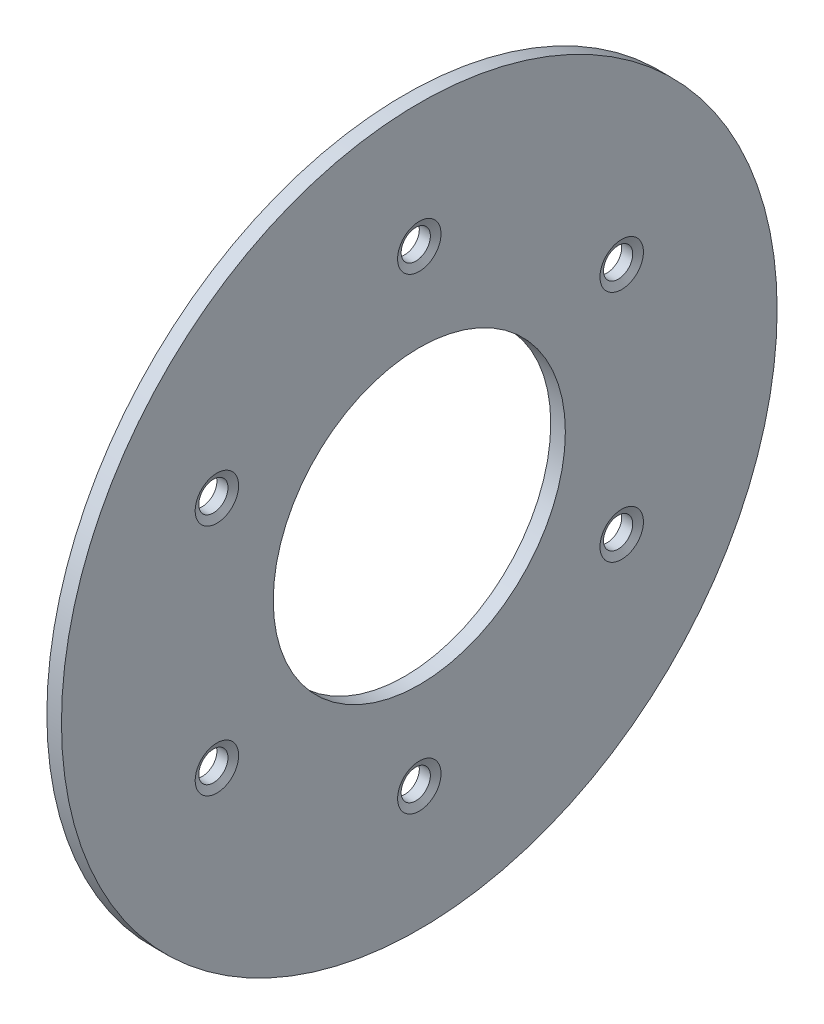
ISO-10303-21;
HEADER;
FILE_DESCRIPTION(('STEP AP214'),'2;1');
FILE_NAME('part.step','',(''),(''),'','','');
FILE_SCHEMA(('AUTOMOTIVE_DESIGN { 1 0 10303 214 1 1 1 1 }'));
ENDSEC;
DATA;
#1=APPLICATION_CONTEXT('core data for automotive mechanical design processes');
#2=APPLICATION_PROTOCOL_DEFINITION('international standard','automotive_design',2000,#1);
#3=PRODUCT_CONTEXT('',#1,'mechanical');
#4=PRODUCT('Part','Part','',(#3));
#5=PRODUCT_RELATED_PRODUCT_CATEGORY('part','',(#4));
#6=PRODUCT_DEFINITION_FORMATION('','',#4);
#7=PRODUCT_DEFINITION_CONTEXT('part definition',#1,'design');
#8=PRODUCT_DEFINITION('design','',#6,#7);
#9=PRODUCT_DEFINITION_SHAPE('','',#8);
#10=(LENGTH_UNIT() NAMED_UNIT(*) SI_UNIT(.MILLI.,.METRE.));
#11=(NAMED_UNIT(*) PLANE_ANGLE_UNIT() SI_UNIT($,.RADIAN.));
#12=(NAMED_UNIT(*) SI_UNIT($,.STERADIAN.) SOLID_ANGLE_UNIT());
#13=UNCERTAINTY_MEASURE_WITH_UNIT(LENGTH_MEASURE(1.E-05),#10,'distance_accuracy_value','');
#14=(GEOMETRIC_REPRESENTATION_CONTEXT(3) GLOBAL_UNCERTAINTY_ASSIGNED_CONTEXT((#13)) GLOBAL_UNIT_ASSIGNED_CONTEXT((#10,
#11,#12)) REPRESENTATION_CONTEXT('',''));
#15=CARTESIAN_POINT('',(0.,0.,0.));
#16=DIRECTION('',(0.,0.,1.));
#17=DIRECTION('',(1.,0.,0.));
#18=AXIS2_PLACEMENT_3D('',#15,#16,#17);
#19=CARTESIAN_POINT('',(2.,0.,0.));
#20=DIRECTION('',(1.,0.,0.));
#21=DIRECTION('',(0.,0.,-1.));
#22=AXIS2_PLACEMENT_3D('',#19,#20,#21);
#23=PLANE('',#22);
#24=CARTESIAN_POINT('',(2.,32.,4.45823933326039E-13));
#25=DIRECTION('',(1.,0.,0.));
#26=DIRECTION('',(0.,0.,-1.));
#27=AXIS2_PLACEMENT_3D('',#24,#25,#26);
#28=CIRCLE('',#27,2.97370514434851);
#29=CARTESIAN_POINT('',(2.,32.,-2.97370514434806));
#30=VERTEX_POINT('',#29);
#31=EDGE_CURVE('E125',#30,#30,#28,.T.);
#32=ORIENTED_EDGE('',*,*,#31,.F.);
#33=EDGE_LOOP('',(#32));
#34=FACE_BOUND('',#33,.T.);
#35=CARTESIAN_POINT('',(2.,16.0000000000003,-27.7128129211019));
#36=DIRECTION('',(1.,0.,0.));
#37=DIRECTION('',(0.,0.,-1.));
#38=AXIS2_PLACEMENT_3D('',#35,#36,#37);
#39=CIRCLE('',#38,2.97370514434851);
#40=CARTESIAN_POINT('',(2.,16.0000000000003,-30.6865180654504));
#41=VERTEX_POINT('',#40);
#42=EDGE_CURVE('E116',#41,#41,#39,.T.);
#43=ORIENTED_EDGE('',*,*,#42,.F.);
#44=EDGE_LOOP('',(#43));
#45=FACE_BOUND('',#44,.T.);
#46=CARTESIAN_POINT('',(2.,-15.9999999999999,-27.7128129211021));
#47=DIRECTION('',(1.,0.,0.));
#48=DIRECTION('',(0.,0.,-1.));
#49=AXIS2_PLACEMENT_3D('',#46,#47,#48);
#50=CIRCLE('',#49,2.97370514434851);
#51=CARTESIAN_POINT('',(2.,-15.9999999999999,-30.6865180654506));
#52=VERTEX_POINT('',#51);
#53=EDGE_CURVE('E111',#52,#52,#50,.T.);
#54=ORIENTED_EDGE('',*,*,#53,.F.);
#55=EDGE_LOOP('',(#54));
#56=FACE_BOUND('',#55,.T.);
#57=CARTESIAN_POINT('',(2.,-32.,-2.22044604925031E-13));
#58=DIRECTION('',(1.,0.,0.));
#59=DIRECTION('',(0.,0.,-1.));
#60=AXIS2_PLACEMENT_3D('',#57,#58,#59);
#61=CIRCLE('',#60,2.97370514434851);
#62=CARTESIAN_POINT('',(2.,-32.,-2.97370514434873));
#63=VERTEX_POINT('',#62);
#64=EDGE_CURVE('E108',#63,#63,#61,.T.);
#65=ORIENTED_EDGE('',*,*,#64,.F.);
#66=EDGE_LOOP('',(#65));
#67=FACE_BOUND('',#66,.T.);
#68=CARTESIAN_POINT('',(2.,-16.0000000000001,27.712812921102));
#69=DIRECTION('',(1.,0.,0.));
#70=DIRECTION('',(0.,0.,-1.));
#71=AXIS2_PLACEMENT_3D('',#68,#69,#70);
#72=CIRCLE('',#71,2.97370514434851);
#73=CARTESIAN_POINT('',(2.,-16.0000000000001,24.7391077767535));
#74=VERTEX_POINT('',#73);
#75=EDGE_CURVE('E102',#74,#74,#72,.T.);
#76=ORIENTED_EDGE('',*,*,#75,.F.);
#77=EDGE_LOOP('',(#76));
#78=FACE_BOUND('',#77,.T.);
#79=CARTESIAN_POINT('',(2.,15.9999999999999,27.7128129211021));
#80=DIRECTION('',(1.,0.,0.));
#81=DIRECTION('',(0.,0.,-1.));
#82=AXIS2_PLACEMENT_3D('',#79,#80,#81);
#83=CIRCLE('',#82,2.97370514434851);
#84=CARTESIAN_POINT('',(2.,15.9999999999999,24.7391077767536));
#85=VERTEX_POINT('',#84);
#86=EDGE_CURVE('E103',#85,#85,#83,.T.);
#87=ORIENTED_EDGE('',*,*,#86,.F.);
#88=EDGE_LOOP('',(#87));
#89=FACE_BOUND('',#88,.T.);
#90=CARTESIAN_POINT('',(2.,0.,0.));
#91=DIRECTION('',(1.,0.,0.));
#92=DIRECTION('',(0.,0.,-1.));
#93=AXIS2_PLACEMENT_3D('',#90,#91,#92);
#94=CIRCLE('',#93,49.);
#95=CARTESIAN_POINT('',(2.,0.,-49.));
#96=VERTEX_POINT('',#95);
#97=EDGE_CURVE('E11',#96,#96,#94,.T.);
#98=ORIENTED_EDGE('',*,*,#97,.T.);
#99=EDGE_LOOP('',(#98));
#100=FACE_BOUND('',#99,.T.);
#101=CARTESIAN_POINT('',(2.,0.,0.));
#102=DIRECTION('',(1.,0.,0.));
#103=DIRECTION('',(0.,0.,-1.));
#104=AXIS2_PLACEMENT_3D('',#101,#102,#103);
#105=CIRCLE('',#104,20.);
#106=CARTESIAN_POINT('',(2.,0.,-20.));
#107=VERTEX_POINT('',#106);
#108=EDGE_CURVE('E91',#107,#107,#105,.T.);
#109=ORIENTED_EDGE('',*,*,#108,.F.);
#110=EDGE_LOOP('',(#109));
#111=FACE_BOUND('',#110,.T.);
#112=ADVANCED_FACE('F80',(#34,#45,#56,#67,#78,#89,#100,#111),#23,.T.);
#113=CARTESIAN_POINT('',(0.,0.,0.));
#114=DIRECTION('',(1.,0.,0.));
#115=DIRECTION('',(0.,0.,-1.));
#116=AXIS2_PLACEMENT_3D('',#113,#114,#115);
#117=PLANE('',#116);
#118=CARTESIAN_POINT('',(0.,16.0000000000003,-27.7128129211019));
#119=DIRECTION('',(1.,0.,0.));
#120=DIRECTION('',(0.,-0.866025403784433,-0.50000000000001));
#121=AXIS2_PLACEMENT_3D('',#118,#119,#120);
#122=CIRCLE('',#121,2.);
#123=CARTESIAN_POINT('',(0.,14.2679491924315,-28.7128129211019));
#124=VERTEX_POINT('',#123);
#125=EDGE_CURVE('E147',#124,#124,#122,.T.);
#126=ORIENTED_EDGE('',*,*,#125,.T.);
#127=EDGE_LOOP('',(#126));
#128=FACE_BOUND('',#127,.T.);
#129=CARTESIAN_POINT('',(0.,-15.9999999999998,-27.7128129211022));
#130=DIRECTION('',(1.,0.,0.));
#131=DIRECTION('',(0.,-0.866025403784443,0.499999999999992));
#132=AXIS2_PLACEMENT_3D('',#129,#130,#131);
#133=CIRCLE('',#132,2.);
#134=CARTESIAN_POINT('',(0.,-17.7320508075686,-26.7128129211022));
#135=VERTEX_POINT('',#134);
#136=EDGE_CURVE('E159',#135,#135,#133,.T.);
#137=ORIENTED_EDGE('',*,*,#136,.T.);
#138=EDGE_LOOP('',(#137));
#139=FACE_BOUND('',#138,.T.);
#140=CARTESIAN_POINT('',(0.,-32.,0.));
#141=DIRECTION('',(1.,0.,0.));
#142=DIRECTION('',(0.,0.,1.));
#143=AXIS2_PLACEMENT_3D('',#140,#141,#142);
#144=CIRCLE('',#143,2.);
#145=CARTESIAN_POINT('',(0.,-32.,2.));
#146=VERTEX_POINT('',#145);
#147=EDGE_CURVE('E156',#146,#146,#144,.T.);
#148=ORIENTED_EDGE('',*,*,#147,.T.);
#149=EDGE_LOOP('',(#148));
#150=FACE_BOUND('',#149,.T.);
#151=CARTESIAN_POINT('',(0.,-16.0000000000001,27.712812921102));
#152=DIRECTION('',(1.,0.,0.));
#153=DIRECTION('',(0.,0.866025403784436,0.500000000000004));
#154=AXIS2_PLACEMENT_3D('',#151,#152,#153);
#155=CIRCLE('',#154,2.);
#156=CARTESIAN_POINT('',(0.,-14.2679491924313,28.712812921102));
#157=VERTEX_POINT('',#156);
#158=EDGE_CURVE('E151',#157,#157,#155,.T.);
#159=ORIENTED_EDGE('',*,*,#158,.T.);
#160=EDGE_LOOP('',(#159));
#161=FACE_BOUND('',#160,.T.);
#162=CARTESIAN_POINT('',(0.,15.9999999999999,27.7128129211021));
#163=DIRECTION('',(1.,0.,0.));
#164=DIRECTION('',(0.,0.86602540378444,-0.499999999999998));
#165=AXIS2_PLACEMENT_3D('',#162,#163,#164);
#166=CIRCLE('',#165,2.);
#167=CARTESIAN_POINT('',(0.,17.7320508075688,26.7128129211021));
#168=VERTEX_POINT('',#167);
#169=EDGE_CURVE('E154',#168,#168,#166,.T.);
#170=ORIENTED_EDGE('',*,*,#169,.T.);
#171=EDGE_LOOP('',(#170));
#172=FACE_BOUND('',#171,.T.);
#173=CARTESIAN_POINT('',(0.,32.,0.));
#174=DIRECTION('',(1.,0.,0.));
#175=DIRECTION('',(0.,0.,-1.));
#176=AXIS2_PLACEMENT_3D('',#173,#174,#175);
#177=CIRCLE('',#176,2.);
#178=CARTESIAN_POINT('',(0.,32.,-2.));
#179=VERTEX_POINT('',#178);
#180=EDGE_CURVE('E168',#179,#179,#177,.T.);
#181=ORIENTED_EDGE('',*,*,#180,.T.);
#182=EDGE_LOOP('',(#181));
#183=FACE_BOUND('',#182,.T.);
#184=CARTESIAN_POINT('',(0.,0.,0.));
#185=DIRECTION('',(1.,0.,0.));
#186=DIRECTION('',(0.,0.,-1.));
#187=AXIS2_PLACEMENT_3D('',#184,#185,#186);
#188=CIRCLE('',#187,49.);
#189=CARTESIAN_POINT('',(0.,0.,-49.));
#190=VERTEX_POINT('',#189);
#191=EDGE_CURVE('E88',#190,#190,#188,.T.);
#192=ORIENTED_EDGE('',*,*,#191,.F.);
#193=EDGE_LOOP('',(#192));
#194=FACE_BOUND('',#193,.T.);
#195=CARTESIAN_POINT('',(0.,0.,0.));
#196=DIRECTION('',(1.,0.,0.));
#197=DIRECTION('',(0.,0.,-1.));
#198=AXIS2_PLACEMENT_3D('',#195,#196,#197);
#199=CIRCLE('',#198,20.);
#200=CARTESIAN_POINT('',(0.,0.,-20.));
#201=VERTEX_POINT('',#200);
#202=EDGE_CURVE('E96',#201,#201,#199,.T.);
#203=ORIENTED_EDGE('',*,*,#202,.T.);
#204=EDGE_LOOP('',(#203));
#205=FACE_BOUND('',#204,.T.);
#206=ADVANCED_FACE('F181',(#128,#139,#150,#161,#172,#183,#194,#205),#117,.F.);
#207=CARTESIAN_POINT('',(2.,0.,0.));
#208=DIRECTION('',(-1.,0.,0.));
#209=DIRECTION('',(0.,0.,1.));
#210=AXIS2_PLACEMENT_3D('',#207,#208,#209);
#211=CYLINDRICAL_SURFACE('',#210,49.);
#212=ORIENTED_EDGE('',*,*,#97,.F.);
#213=EDGE_LOOP('',(#212));
#214=FACE_BOUND('',#213,.T.);
#215=ORIENTED_EDGE('',*,*,#191,.T.);
#216=EDGE_LOOP('',(#215));
#217=FACE_BOUND('',#216,.T.);
#218=ADVANCED_FACE('F77',(#214,#217),#211,.T.);
#219=CARTESIAN_POINT('',(2.,0.,0.));
#220=DIRECTION('',(-1.,0.,0.));
#221=DIRECTION('',(0.,0.,1.));
#222=AXIS2_PLACEMENT_3D('',#219,#220,#221);
#223=CYLINDRICAL_SURFACE('',#222,20.);
#224=ORIENTED_EDGE('',*,*,#108,.T.);
#225=EDGE_LOOP('',(#224));
#226=FACE_BOUND('',#225,.T.);
#227=ORIENTED_EDGE('',*,*,#202,.F.);
#228=EDGE_LOOP('',(#227));
#229=FACE_BOUND('',#228,.T.);
#230=ADVANCED_FACE('F183',(#226,#229),#223,.F.);
#231=CARTESIAN_POINT('',(0.5,32.,0.));
#232=DIRECTION('',(-1.,0.,0.));
#233=DIRECTION('',(0.,0.,1.));
#234=AXIS2_PLACEMENT_3D('',#231,#232,#233);
#235=CYLINDRICAL_SURFACE('',#234,2.);
#236=CARTESIAN_POINT('',(1.5134671172586,32.,4.45823933326039E-13));
#237=DIRECTION('',(1.,0.,0.));
#238=DIRECTION('',(0.,0.,-1.));
#239=AXIS2_PLACEMENT_3D('',#236,#237,#238);
#240=CIRCLE('',#239,2.);
#241=CARTESIAN_POINT('',(1.5134671172586,32.,-1.99999999999956));
#242=VERTEX_POINT('',#241);
#243=EDGE_CURVE('E82',#242,#242,#240,.F.);
#244=ORIENTED_EDGE('',*,*,#243,.F.);
#245=EDGE_LOOP('',(#244));
#246=FACE_BOUND('',#245,.T.);
#247=ORIENTED_EDGE('',*,*,#180,.F.);
#248=EDGE_LOOP('',(#247));
#249=FACE_BOUND('',#248,.T.);
#250=ADVANCED_FACE('F190',(#246,#249),#235,.F.);
#251=CARTESIAN_POINT('',(0.5,15.9999999999999,27.7128129211021));
#252=DIRECTION('',(-1.,0.,0.));
#253=DIRECTION('',(0.,0.,1.));
#254=AXIS2_PLACEMENT_3D('',#251,#252,#253);
#255=CYLINDRICAL_SURFACE('',#254,2.);
#256=CARTESIAN_POINT('',(1.5134671172586,15.9999999999999,27.7128129211021));
#257=DIRECTION('',(1.,0.,0.));
#258=DIRECTION('',(0.,0.,-1.));
#259=AXIS2_PLACEMENT_3D('',#256,#257,#258);
#260=CIRCLE('',#259,2.);
#261=CARTESIAN_POINT('',(1.5134671172586,15.9999999999999,25.7128129211021));
#262=VERTEX_POINT('',#261);
#263=EDGE_CURVE('E97',#262,#262,#260,.F.);
#264=ORIENTED_EDGE('',*,*,#263,.F.);
#265=EDGE_LOOP('',(#264));
#266=FACE_BOUND('',#265,.T.);
#267=ORIENTED_EDGE('',*,*,#169,.F.);
#268=EDGE_LOOP('',(#267));
#269=FACE_BOUND('',#268,.T.);
#270=ADVANCED_FACE('F194',(#266,#269),#255,.F.);
#271=CARTESIAN_POINT('',(0.5,-16.0000000000001,27.712812921102));
#272=DIRECTION('',(-1.,0.,0.));
#273=DIRECTION('',(0.,0.,1.));
#274=AXIS2_PLACEMENT_3D('',#271,#272,#273);
#275=CYLINDRICAL_SURFACE('',#274,2.);
#276=CARTESIAN_POINT('',(1.5134671172586,-16.0000000000001,27.712812921102));
#277=DIRECTION('',(1.,0.,0.));
#278=DIRECTION('',(0.,0.,-1.));
#279=AXIS2_PLACEMENT_3D('',#276,#277,#278);
#280=CIRCLE('',#279,2.);
#281=CARTESIAN_POINT('',(1.5134671172586,-16.0000000000001,25.712812921102));
#282=VERTEX_POINT('',#281);
#283=EDGE_CURVE('E104',#282,#282,#280,.F.);
#284=ORIENTED_EDGE('',*,*,#283,.F.);
#285=EDGE_LOOP('',(#284));
#286=FACE_BOUND('',#285,.T.);
#287=ORIENTED_EDGE('',*,*,#158,.F.);
#288=EDGE_LOOP('',(#287));
#289=FACE_BOUND('',#288,.T.);
#290=ADVANCED_FACE('F228',(#286,#289),#275,.F.);
#291=CARTESIAN_POINT('',(0.5,-32.,0.));
#292=DIRECTION('',(-1.,0.,0.));
#293=DIRECTION('',(0.,0.,1.));
#294=AXIS2_PLACEMENT_3D('',#291,#292,#293);
#295=CYLINDRICAL_SURFACE('',#294,2.);
#296=CARTESIAN_POINT('',(1.5134671172586,-32.,-2.22044604925031E-13));
#297=DIRECTION('',(1.,0.,0.));
#298=DIRECTION('',(0.,0.,-1.));
#299=AXIS2_PLACEMENT_3D('',#296,#297,#298);
#300=CIRCLE('',#299,2.);
#301=CARTESIAN_POINT('',(1.5134671172586,-32.,-2.00000000000023));
#302=VERTEX_POINT('',#301);
#303=EDGE_CURVE('E109',#302,#302,#300,.F.);
#304=ORIENTED_EDGE('',*,*,#303,.F.);
#305=EDGE_LOOP('',(#304));
#306=FACE_BOUND('',#305,.T.);
#307=ORIENTED_EDGE('',*,*,#147,.F.);
#308=EDGE_LOOP('',(#307));
#309=FACE_BOUND('',#308,.T.);
#310=ADVANCED_FACE('F239',(#306,#309),#295,.F.);
#311=CARTESIAN_POINT('',(0.5,-15.9999999999998,-27.7128129211022));
#312=DIRECTION('',(-1.,0.,0.));
#313=DIRECTION('',(0.,0.,1.));
#314=AXIS2_PLACEMENT_3D('',#311,#312,#313);
#315=CYLINDRICAL_SURFACE('',#314,2.);
#316=CARTESIAN_POINT('',(1.5134671172586,-15.9999999999999,-27.7128129211021));
#317=DIRECTION('',(1.,0.,0.));
#318=DIRECTION('',(0.,0.,-1.));
#319=AXIS2_PLACEMENT_3D('',#316,#317,#318);
#320=CIRCLE('',#319,2.);
#321=CARTESIAN_POINT('',(1.5134671172586,-15.9999999999999,-29.7128129211021));
#322=VERTEX_POINT('',#321);
#323=EDGE_CURVE('E113',#322,#322,#320,.F.);
#324=ORIENTED_EDGE('',*,*,#323,.F.);
#325=EDGE_LOOP('',(#324));
#326=FACE_BOUND('',#325,.T.);
#327=ORIENTED_EDGE('',*,*,#136,.F.);
#328=EDGE_LOOP('',(#327));
#329=FACE_BOUND('',#328,.T.);
#330=ADVANCED_FACE('F244',(#326,#329),#315,.F.);
#331=CARTESIAN_POINT('',(0.5,16.0000000000003,-27.7128129211019));
#332=DIRECTION('',(-1.,0.,0.));
#333=DIRECTION('',(0.,0.,1.));
#334=AXIS2_PLACEMENT_3D('',#331,#332,#333);
#335=CYLINDRICAL_SURFACE('',#334,2.);
#336=CARTESIAN_POINT('',(1.5134671172586,16.0000000000003,-27.7128129211019));
#337=DIRECTION('',(1.,0.,0.));
#338=DIRECTION('',(0.,0.,-1.));
#339=AXIS2_PLACEMENT_3D('',#336,#337,#338);
#340=CIRCLE('',#339,2.);
#341=CARTESIAN_POINT('',(1.5134671172586,16.0000000000003,-29.7128129211019));
#342=VERTEX_POINT('',#341);
#343=EDGE_CURVE('E117',#342,#342,#340,.F.);
#344=ORIENTED_EDGE('',*,*,#343,.F.);
#345=EDGE_LOOP('',(#344));
#346=FACE_BOUND('',#345,.T.);
#347=ORIENTED_EDGE('',*,*,#125,.F.);
#348=EDGE_LOOP('',(#347));
#349=FACE_BOUND('',#348,.T.);
#350=ADVANCED_FACE('F219',(#346,#349),#335,.F.);
#351=CARTESIAN_POINT('',(2.49931716044968,15.9999999999999,27.7128129211021));
#352=DIRECTION('',(1.,0.,0.));
#353=DIRECTION('',(0.,0.,-1.));
#354=AXIS2_PLACEMENT_3D('',#351,#352,#353);
#355=CONICAL_SURFACE('',#354,3.97299564461619,1.1074114103904);
#356=ORIENTED_EDGE('',*,*,#86,.T.);
#357=EDGE_LOOP('',(#356));
#358=FACE_BOUND('',#357,.T.);
#359=ORIENTED_EDGE('',*,*,#263,.T.);
#360=EDGE_LOOP('',(#359));
#361=FACE_BOUND('',#360,.T.);
#362=ADVANCED_FACE('F220',(#358,#361),#355,.F.);
#363=CARTESIAN_POINT('',(2.49931716044968,-16.0000000000001,27.712812921102));
#364=DIRECTION('',(1.,0.,0.));
#365=DIRECTION('',(0.,0.86602540378444,-0.499999999999998));
#366=AXIS2_PLACEMENT_3D('',#363,#364,#365);
#367=CONICAL_SURFACE('',#366,3.97299564461619,1.1074114103904);
#368=ORIENTED_EDGE('',*,*,#75,.T.);
#369=EDGE_LOOP('',(#368));
#370=FACE_BOUND('',#369,.T.);
#371=ORIENTED_EDGE('',*,*,#283,.T.);
#372=EDGE_LOOP('',(#371));
#373=FACE_BOUND('',#372,.T.);
#374=ADVANCED_FACE('F218',(#370,#373),#367,.F.);
#375=CARTESIAN_POINT('',(2.49931716044968,-32.,-2.22044604925031E-13));
#376=DIRECTION('',(1.,0.,0.));
#377=DIRECTION('',(0.,0.866025403784436,0.500000000000004));
#378=AXIS2_PLACEMENT_3D('',#375,#376,#377);
#379=CONICAL_SURFACE('',#378,3.97299564461619,1.1074114103904);
#380=ORIENTED_EDGE('',*,*,#64,.T.);
#381=EDGE_LOOP('',(#380));
#382=FACE_BOUND('',#381,.T.);
#383=ORIENTED_EDGE('',*,*,#303,.T.);
#384=EDGE_LOOP('',(#383));
#385=FACE_BOUND('',#384,.T.);
#386=ADVANCED_FACE('F254',(#382,#385),#379,.F.);
#387=CARTESIAN_POINT('',(2.49931716044968,-15.9999999999999,-27.7128129211021));
#388=DIRECTION('',(1.,0.,0.));
#389=DIRECTION('',(0.,0.,1.));
#390=AXIS2_PLACEMENT_3D('',#387,#388,#389);
#391=CONICAL_SURFACE('',#390,3.97299564461619,1.1074114103904);
#392=ORIENTED_EDGE('',*,*,#53,.T.);
#393=EDGE_LOOP('',(#392));
#394=FACE_BOUND('',#393,.T.);
#395=ORIENTED_EDGE('',*,*,#323,.T.);
#396=EDGE_LOOP('',(#395));
#397=FACE_BOUND('',#396,.T.);
#398=ADVANCED_FACE('F259',(#394,#397),#391,.F.);
#399=CARTESIAN_POINT('',(2.49931716044968,16.0000000000003,-27.7128129211019));
#400=DIRECTION('',(1.,0.,0.));
#401=DIRECTION('',(0.,-0.866025403784443,0.499999999999992));
#402=AXIS2_PLACEMENT_3D('',#399,#400,#401);
#403=CONICAL_SURFACE('',#402,3.97299564461619,1.1074114103904);
#404=ORIENTED_EDGE('',*,*,#42,.T.);
#405=EDGE_LOOP('',(#404));
#406=FACE_BOUND('',#405,.T.);
#407=ORIENTED_EDGE('',*,*,#343,.T.);
#408=EDGE_LOOP('',(#407));
#409=FACE_BOUND('',#408,.T.);
#410=ADVANCED_FACE('F263',(#406,#409),#403,.F.);
#411=CARTESIAN_POINT('',(2.49931716044968,32.,4.45823933326039E-13));
#412=DIRECTION('',(1.,0.,0.));
#413=DIRECTION('',(0.,-0.866025403784433,-0.50000000000001));
#414=AXIS2_PLACEMENT_3D('',#411,#412,#413);
#415=CONICAL_SURFACE('',#414,3.97299564461619,1.1074114103904);
#416=ORIENTED_EDGE('',*,*,#31,.T.);
#417=EDGE_LOOP('',(#416));
#418=FACE_BOUND('',#417,.T.);
#419=ORIENTED_EDGE('',*,*,#243,.T.);
#420=EDGE_LOOP('',(#419));
#421=FACE_BOUND('',#420,.T.);
#422=ADVANCED_FACE('F270',(#418,#421),#415,.F.);
#423=CLOSED_SHELL('',(#112,#206,#218,#230,#250,#270,#290,#310,#330,#350,#362,#374,#386,#398,
#410,#422));
#424=MANIFOLD_SOLID_BREP('B2',#423);
#425=ADVANCED_BREP_SHAPE_REPRESENTATION('',(#18,#424),#14);
#426=SHAPE_DEFINITION_REPRESENTATION(#9,#425);
ENDSEC;
END-ISO-10303-21;
